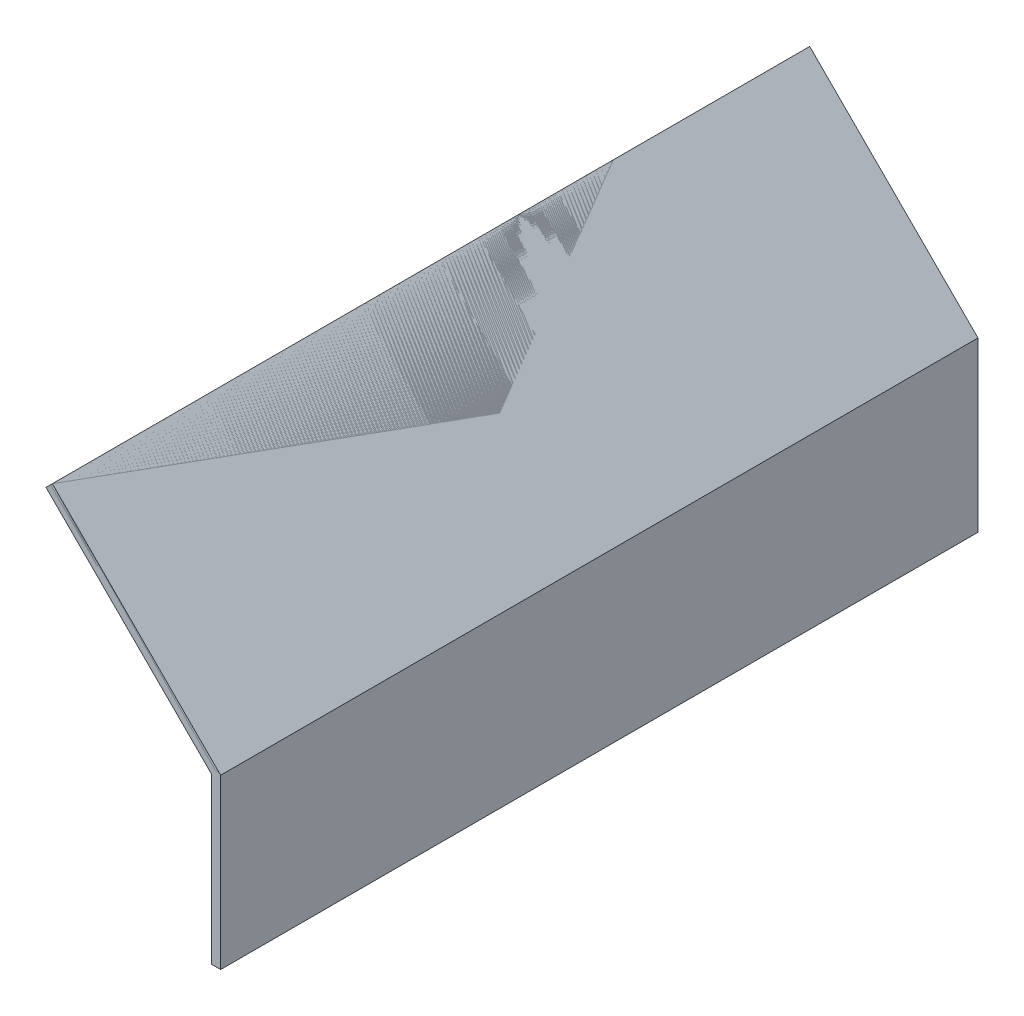
ISO-10303-21;
HEADER;
FILE_DESCRIPTION(('STEP AP214'),'2;1');
FILE_NAME('part.step','',(''),(''),'','','');
FILE_SCHEMA(('AUTOMOTIVE_DESIGN { 1 0 10303 214 1 1 1 1 }'));
ENDSEC;
DATA;
#1=APPLICATION_CONTEXT('core data for automotive mechanical design processes');
#2=APPLICATION_PROTOCOL_DEFINITION('international standard','automotive_design',2000,#1);
#3=PRODUCT_CONTEXT('',#1,'mechanical');
#4=PRODUCT('Part','Part','',(#3));
#5=PRODUCT_RELATED_PRODUCT_CATEGORY('part','',(#4));
#6=PRODUCT_DEFINITION_FORMATION('','',#4);
#7=PRODUCT_DEFINITION_CONTEXT('part definition',#1,'design');
#8=PRODUCT_DEFINITION('design','',#6,#7);
#9=PRODUCT_DEFINITION_SHAPE('','',#8);
#10=(LENGTH_UNIT() NAMED_UNIT(*) SI_UNIT(.MILLI.,.METRE.));
#11=(NAMED_UNIT(*) PLANE_ANGLE_UNIT() SI_UNIT($,.RADIAN.));
#12=(NAMED_UNIT(*) SI_UNIT($,.STERADIAN.) SOLID_ANGLE_UNIT());
#13=UNCERTAINTY_MEASURE_WITH_UNIT(LENGTH_MEASURE(1.E-05),#10,'distance_accuracy_value','');
#14=(GEOMETRIC_REPRESENTATION_CONTEXT(3) GLOBAL_UNCERTAINTY_ASSIGNED_CONTEXT((#13)) GLOBAL_UNIT_ASSIGNED_CONTEXT((#10,
#11,#12)) REPRESENTATION_CONTEXT('',''));
#15=CARTESIAN_POINT('',(0.,0.,0.));
#16=DIRECTION('',(0.,0.,1.));
#17=DIRECTION('',(1.,0.,0.));
#18=AXIS2_PLACEMENT_3D('',#15,#16,#17);
#19=CARTESIAN_POINT('',(4.064,76.2,0.));
#20=DIRECTION('',(0.,0.,-1.));
#21=DIRECTION('',(-0.707106781186549,0.707106781186546,0.));
#22=AXIS2_PLACEMENT_3D('',#19,#20,#21);
#23=PLANE('',#22);
#24=DIRECTION('',(-0.707106781186549,0.707106781186546,0.));
#25=VECTOR('',#24,1.);
#26=CARTESIAN_POINT('',(3.20548751482579,75.3414875148258,0.));
#27=LINE('',#26,#25);
#28=CARTESIAN_POINT('',(1.61939312693271,76.9275819027189,0.));
#29=VERTEX_POINT('',#28);
#30=CARTESIAN_POINT('',(-72.9945124851745,151.541487514826,0.));
#31=VERTEX_POINT('',#30);
#32=EDGE_CURVE('E182',#29,#31,#27,.T.);
#33=ORIENTED_EDGE('',*,*,#32,.F.);
#34=DIRECTION('',(1.,0.,0.));
#35=VECTOR('',#34,1.);
#36=CARTESIAN_POINT('',(-139.7,76.9275819027189,0.));
#37=LINE('',#36,#35);
#38=CARTESIAN_POINT('',(3.33641809728114,76.9275819027189,0.));
#39=VERTEX_POINT('',#38);
#40=EDGE_CURVE('E219',#29,#39,#37,.T.);
#41=ORIENTED_EDGE('',*,*,#40,.T.);
#42=DIRECTION('',(-0.707106781186549,0.707106781186546,0.));
#43=VECTOR('',#42,1.);
#44=CARTESIAN_POINT('',(4.064,76.2,0.));
#45=LINE('',#44,#43);
#46=CARTESIAN_POINT('',(-72.1360000000003,152.4,0.));
#47=VERTEX_POINT('',#46);
#48=EDGE_CURVE('E160',#39,#47,#45,.T.);
#49=ORIENTED_EDGE('',*,*,#48,.T.);
#50=DIRECTION('',(0.707106781186546,0.707106781186549,0.));
#51=VECTOR('',#50,1.);
#52=CARTESIAN_POINT('',(-72.1360000000003,152.4,0.));
#53=LINE('',#52,#51);
#54=EDGE_CURVE('E156',#31,#47,#53,.T.);
#55=ORIENTED_EDGE('',*,*,#54,.F.);
#56=EDGE_LOOP('',(#33,#41,#49,#55));
#57=FACE_BOUND('',#56,.T.);
#58=ADVANCED_FACE('F54',(#57),#23,.F.);
#59=CARTESIAN_POINT('',(3.20548751482579,75.3414875148258,-342.9));
#60=DIRECTION('',(0.707106781186546,0.707106781186549,0.));
#61=DIRECTION('',(-0.707106781186549,0.707106781186546,0.));
#62=AXIS2_PLACEMENT_3D('',#59,#60,#61);
#63=PLANE('',#62);
#64=DIRECTION('',(0.,0.,1.));
#65=VECTOR('',#64,1.);
#66=CARTESIAN_POINT('',(-72.9945124851745,151.541487514826,-342.9));
#67=LINE('',#66,#65);
#68=CARTESIAN_POINT('',(-72.9945124851745,151.541487514826,-254.));
#69=VERTEX_POINT('',#68);
#70=EDGE_CURVE('E181',#69,#31,#67,.T.);
#71=ORIENTED_EDGE('',*,*,#70,.F.);
#72=DIRECTION('',(0.707106781186549,-0.707106781186546,0.));
#73=VECTOR('',#72,1.);
#74=CARTESIAN_POINT('',(3.20548751482581,75.3414875148258,-254.));
#75=LINE('',#74,#73);
#76=CARTESIAN_POINT('',(1.61939312693271,76.9275819027189,-254.));
#77=VERTEX_POINT('',#76);
#78=EDGE_CURVE('E138',#69,#77,#75,.T.);
#79=ORIENTED_EDGE('',*,*,#78,.T.);
#80=DIRECTION('',(0.,0.,1.));
#81=VECTOR('',#80,1.);
#82=CARTESIAN_POINT('',(1.6193931269327,76.9275819027189,-342.9));
#83=LINE('',#82,#81);
#84=CARTESIAN_POINT('',(1.61939312693271,76.9275819027189,-206.375));
#85=VERTEX_POINT('',#84);
#86=EDGE_CURVE('E247',#77,#85,#83,.T.);
#87=ORIENTED_EDGE('',*,*,#86,.T.);
#88=DIRECTION('',(0.707106781186549,-0.707106781186546,0.));
#89=VECTOR('',#88,1.);
#90=CARTESIAN_POINT('',(3.20548751482579,75.3414875148258,-206.375));
#91=LINE('',#90,#89);
#92=CARTESIAN_POINT('',(2.47790561210692,76.0690694175447,-206.375));
#93=VERTEX_POINT('',#92);
#94=EDGE_CURVE('E270',#85,#93,#91,.T.);
#95=ORIENTED_EDGE('',*,*,#94,.T.);
#96=DIRECTION('',(0.,0.,1.));
#97=VECTOR('',#96,1.);
#98=CARTESIAN_POINT('',(2.47790561210692,76.0690694175447,-342.9));
#99=LINE('',#98,#97);
#100=CARTESIAN_POINT('',(2.47790561210692,76.0690694175447,-73.025));
#101=VERTEX_POINT('',#100);
#102=EDGE_CURVE('E174',#101,#93,#99,.F.);
#103=ORIENTED_EDGE('',*,*,#102,.F.);
#104=DIRECTION('',(-0.707106781186549,0.707106781186546,0.));
#105=VECTOR('',#104,1.);
#106=CARTESIAN_POINT('',(3.20548751482579,75.3414875148258,-73.025));
#107=LINE('',#106,#105);
#108=CARTESIAN_POINT('',(1.61939312693271,76.9275819027189,-73.025));
#109=VERTEX_POINT('',#108);
#110=EDGE_CURVE('E218',#101,#109,#107,.T.);
#111=ORIENTED_EDGE('',*,*,#110,.T.);
#112=DIRECTION('',(0.,0.,-1.));
#113=VECTOR('',#112,1.);
#114=CARTESIAN_POINT('',(1.6193931269327,76.9275819027189,-342.9));
#115=LINE('',#114,#113);
#116=EDGE_CURVE('E198',#29,#109,#115,.T.);
#117=ORIENTED_EDGE('',*,*,#116,.F.);
#118=ORIENTED_EDGE('',*,*,#32,.T.);
#119=EDGE_LOOP('',(#71,#79,#87,#95,#103,#111,#117,#118));
#120=FACE_BOUND('',#119,.T.);
#121=ADVANCED_FACE('F300',(#120),#63,.F.);
#122=CARTESIAN_POINT('',(4.06400000000001,0.,-342.9));
#123=DIRECTION('',(0.,1.,0.));
#124=DIRECTION('',(0.,0.,1.));
#125=AXIS2_PLACEMENT_3D('',#122,#123,#124);
#126=PLANE('',#125);
#127=DIRECTION('',(1.,0.,0.));
#128=VECTOR('',#127,1.);
#129=CARTESIAN_POINT('',(-139.7,0.,-206.375));
#130=LINE('',#129,#128);
#131=CARTESIAN_POINT('',(2.84988,0.,-206.375));
#132=VERTEX_POINT('',#131);
#133=CARTESIAN_POINT('',(4.06400000000001,0.,-206.375));
#134=VERTEX_POINT('',#133);
#135=EDGE_CURVE('E240',#132,#134,#130,.T.);
#136=ORIENTED_EDGE('',*,*,#135,.T.);
#137=DIRECTION('',(0.,0.,1.));
#138=VECTOR('',#137,1.);
#139=CARTESIAN_POINT('',(4.06400000000001,0.,-342.9));
#140=LINE('',#139,#138);
#141=CARTESIAN_POINT('',(4.06400000000001,0.,-73.025));
#142=VERTEX_POINT('',#141);
#143=EDGE_CURVE('E165',#134,#142,#140,.T.);
#144=ORIENTED_EDGE('',*,*,#143,.T.);
#145=DIRECTION('',(1.,0.,0.));
#146=VECTOR('',#145,1.);
#147=CARTESIAN_POINT('',(-139.7,0.,-73.025));
#148=LINE('',#147,#146);
#149=CARTESIAN_POINT('',(2.84988,0.,-73.025));
#150=VERTEX_POINT('',#149);
#151=EDGE_CURVE('E239',#150,#142,#148,.T.);
#152=ORIENTED_EDGE('',*,*,#151,.F.);
#153=DIRECTION('',(0.,0.,1.));
#154=VECTOR('',#153,1.);
#155=CARTESIAN_POINT('',(2.84988000000001,0.,-342.9));
#156=LINE('',#155,#154);
#157=EDGE_CURVE('E186',#132,#150,#156,.T.);
#158=ORIENTED_EDGE('',*,*,#157,.F.);
#159=EDGE_LOOP('',(#136,#144,#152,#158));
#160=FACE_BOUND('',#159,.T.);
#161=ADVANCED_FACE('F56',(#160),#126,.F.);
#162=CARTESIAN_POINT('',(-72.1360000000003,152.4,-342.9));
#163=DIRECTION('',(-0.707106781186549,0.707106781186546,0.));
#164=DIRECTION('',(0.,0.,1.));
#165=AXIS2_PLACEMENT_3D('',#162,#163,#164);
#166=PLANE('',#165);
#167=DIRECTION('',(0.707106781186546,0.707106781186549,0.));
#168=VECTOR('',#167,1.);
#169=CARTESIAN_POINT('',(-72.1360000000003,152.4,-254.));
#170=LINE('',#169,#168);
#171=CARTESIAN_POINT('',(-72.1360000000003,152.4,-254.));
#172=VERTEX_POINT('',#171);
#173=EDGE_CURVE('E135',#69,#172,#170,.T.);
#174=ORIENTED_EDGE('',*,*,#173,.F.);
#175=ORIENTED_EDGE('',*,*,#70,.T.);
#176=ORIENTED_EDGE('',*,*,#54,.T.);
#177=DIRECTION('',(0.,0.,1.));
#178=VECTOR('',#177,1.);
#179=CARTESIAN_POINT('',(-72.1360000000003,152.4,-342.9));
#180=LINE('',#179,#178);
#181=EDGE_CURVE('E148',#172,#47,#180,.T.);
#182=ORIENTED_EDGE('',*,*,#181,.F.);
#183=EDGE_LOOP('',(#174,#175,#176,#182));
#184=FACE_BOUND('',#183,.T.);
#185=ADVANCED_FACE('F154',(#184),#166,.T.);
#186=CARTESIAN_POINT('',(4.064,76.2,-342.9));
#187=DIRECTION('',(0.707106781186546,0.707106781186549,0.));
#188=DIRECTION('',(-0.707106781186549,0.707106781186546,0.));
#189=AXIS2_PLACEMENT_3D('',#186,#187,#188);
#190=PLANE('',#189);
#191=DIRECTION('',(0.707106781186549,-0.707106781186546,0.));
#192=VECTOR('',#191,1.);
#193=CARTESIAN_POINT('',(4.06400000000002,76.2,-254.));
#194=LINE('',#193,#192);
#195=CARTESIAN_POINT('',(3.33641809728113,76.9275819027189,-254.));
#196=VERTEX_POINT('',#195);
#197=EDGE_CURVE('E70',#172,#196,#194,.T.);
#198=ORIENTED_EDGE('',*,*,#197,.F.);
#199=ORIENTED_EDGE('',*,*,#181,.T.);
#200=ORIENTED_EDGE('',*,*,#48,.F.);
#201=DIRECTION('',(0.,0.,1.));
#202=VECTOR('',#201,1.);
#203=CARTESIAN_POINT('',(3.33641809728113,76.9275819027189,-342.9));
#204=LINE('',#203,#202);
#205=CARTESIAN_POINT('',(3.33641809728113,76.9275819027189,-73.025));
#206=VERTEX_POINT('',#205);
#207=EDGE_CURVE('E169',#39,#206,#204,.F.);
#208=ORIENTED_EDGE('',*,*,#207,.T.);
#209=CARTESIAN_POINT('',(3.33641809728114,76.9275819027189,-206.375));
#210=VERTEX_POINT('',#209);
#211=EDGE_CURVE('E173',#206,#210,#204,.F.);
#212=ORIENTED_EDGE('',*,*,#211,.T.);
#213=EDGE_CURVE('E151',#210,#196,#204,.F.);
#214=ORIENTED_EDGE('',*,*,#213,.T.);
#215=EDGE_LOOP('',(#198,#199,#200,#208,#212,#214));
#216=FACE_BOUND('',#215,.T.);
#217=ADVANCED_FACE('F146',(#216),#190,.T.);
#218=CARTESIAN_POINT('',(4.06400000000001,0.,-342.9));
#219=DIRECTION('',(1.,0.,0.));
#220=DIRECTION('',(0.,1.,0.));
#221=AXIS2_PLACEMENT_3D('',#218,#219,#220);
#222=PLANE('',#221);
#223=CARTESIAN_POINT('',(4.06400000000001,12.7,-193.675));
#224=DIRECTION('',(1.,0.,0.));
#225=DIRECTION('',(0.,1.,0.));
#226=AXIS2_PLACEMENT_3D('',#223,#224,#225);
#227=CIRCLE('',#226,3.26389999999998);
#228=CARTESIAN_POINT('',(4.06400000000001,15.9639,-193.675));
#229=VERTEX_POINT('',#228);
#230=EDGE_CURVE('E279',#229,#229,#227,.T.);
#231=ORIENTED_EDGE('',*,*,#230,.F.);
#232=EDGE_LOOP('',(#231));
#233=FACE_BOUND('',#232,.T.);
#234=CARTESIAN_POINT('',(4.06400000000001,12.7,-85.725));
#235=DIRECTION('',(1.,0.,0.));
#236=DIRECTION('',(0.,1.,0.));
#237=AXIS2_PLACEMENT_3D('',#234,#235,#236);
#238=CIRCLE('',#237,3.26389999999999);
#239=CARTESIAN_POINT('',(4.06400000000001,15.9639,-85.725));
#240=VERTEX_POINT('',#239);
#241=EDGE_CURVE('E285',#240,#240,#238,.T.);
#242=ORIENTED_EDGE('',*,*,#241,.F.);
#243=EDGE_LOOP('',(#242));
#244=FACE_BOUND('',#243,.T.);
#245=DIRECTION('',(0.,-1.,0.));
#246=VECTOR('',#245,1.);
#247=CARTESIAN_POINT('',(4.06400000000001,0.,-206.375));
#248=LINE('',#247,#246);
#249=CARTESIAN_POINT('',(4.064,75.1710438054377,-206.375));
#250=VERTEX_POINT('',#249);
#251=EDGE_CURVE('E251',#250,#134,#248,.T.);
#252=ORIENTED_EDGE('',*,*,#251,.F.);
#253=DIRECTION('',(0.,0.,1.));
#254=VECTOR('',#253,1.);
#255=CARTESIAN_POINT('',(4.064,75.1710438054377,-342.9));
#256=LINE('',#255,#254);
#257=CARTESIAN_POINT('',(4.064,75.1710438054377,-73.025));
#258=VERTEX_POINT('',#257);
#259=EDGE_CURVE('E159',#250,#258,#256,.T.);
#260=ORIENTED_EDGE('',*,*,#259,.T.);
#261=DIRECTION('',(0.,1.,0.));
#262=VECTOR('',#261,1.);
#263=CARTESIAN_POINT('',(4.06400000000001,0.,-73.025));
#264=LINE('',#263,#262);
#265=EDGE_CURVE('E191',#142,#258,#264,.T.);
#266=ORIENTED_EDGE('',*,*,#265,.F.);
#267=ORIENTED_EDGE('',*,*,#143,.F.);
#268=EDGE_LOOP('',(#252,#260,#266,#267));
#269=FACE_BOUND('',#268,.T.);
#270=ADVANCED_FACE('F249',(#233,#244,#269),#222,.T.);
#271=CARTESIAN_POINT('',(1.57988,75.1710438054377,-342.9));
#272=DIRECTION('',(0.,0.,1.));
#273=DIRECTION('',(1.,0.,0.));
#274=AXIS2_PLACEMENT_3D('',#271,#272,#273);
#275=CYLINDRICAL_SURFACE('',#274,2.48412);
#276=CARTESIAN_POINT('',(1.57988,75.1710438054377,-206.375));
#277=DIRECTION('',(0.,0.,1.));
#278=DIRECTION('',(1.,0.,0.));
#279=AXIS2_PLACEMENT_3D('',#276,#277,#278);
#280=CIRCLE('',#279,2.48412);
#281=EDGE_CURVE('E256',#210,#250,#280,.F.);
#282=ORIENTED_EDGE('',*,*,#281,.F.);
#283=ORIENTED_EDGE('',*,*,#211,.F.);
#284=CARTESIAN_POINT('',(1.57988,75.1710438054377,-73.025));
#285=DIRECTION('',(0.,0.,-1.));
#286=DIRECTION('',(-1.,0.,0.));
#287=AXIS2_PLACEMENT_3D('',#284,#285,#286);
#288=CIRCLE('',#287,2.48412);
#289=EDGE_CURVE('E224',#258,#206,#288,.F.);
#290=ORIENTED_EDGE('',*,*,#289,.F.);
#291=ORIENTED_EDGE('',*,*,#259,.F.);
#292=EDGE_LOOP('',(#282,#283,#290,#291));
#293=FACE_BOUND('',#292,.T.);
#294=ADVANCED_FACE('F254',(#293),#275,.T.);
#295=CARTESIAN_POINT('',(2.84988000000001,0.,-342.9));
#296=DIRECTION('',(1.,0.,0.));
#297=DIRECTION('',(0.,1.,0.));
#298=AXIS2_PLACEMENT_3D('',#295,#296,#297);
#299=PLANE('',#298);
#300=CARTESIAN_POINT('',(2.84988000000001,12.7,-193.675));
#301=DIRECTION('',(-1.,0.,0.));
#302=DIRECTION('',(0.,-1.,0.));
#303=AXIS2_PLACEMENT_3D('',#300,#301,#302);
#304=CIRCLE('',#303,3.26389999999998);
#305=CARTESIAN_POINT('',(2.84988000000001,9.43610000000001,-193.675));
#306=VERTEX_POINT('',#305);
#307=EDGE_CURVE('E289',#306,#306,#304,.T.);
#308=ORIENTED_EDGE('',*,*,#307,.F.);
#309=EDGE_LOOP('',(#308));
#310=FACE_BOUND('',#309,.T.);
#311=CARTESIAN_POINT('',(2.84988000000001,12.7,-85.725));
#312=DIRECTION('',(-1.,0.,0.));
#313=DIRECTION('',(0.,-1.,0.));
#314=AXIS2_PLACEMENT_3D('',#311,#312,#313);
#315=CIRCLE('',#314,3.26389999999999);
#316=CARTESIAN_POINT('',(2.84988000000001,9.4361,-85.725));
#317=VERTEX_POINT('',#316);
#318=EDGE_CURVE('E290',#317,#317,#315,.T.);
#319=ORIENTED_EDGE('',*,*,#318,.F.);
#320=EDGE_LOOP('',(#319));
#321=FACE_BOUND('',#320,.T.);
#322=DIRECTION('',(0.,0.,1.));
#323=VECTOR('',#322,1.);
#324=CARTESIAN_POINT('',(2.84988,75.1710438054377,-342.9));
#325=LINE('',#324,#323);
#326=CARTESIAN_POINT('',(2.84988,75.1710438054377,-206.375));
#327=VERTEX_POINT('',#326);
#328=CARTESIAN_POINT('',(2.84988,75.1710438054377,-73.025));
#329=VERTEX_POINT('',#328);
#330=EDGE_CURVE('E178',#327,#329,#325,.T.);
#331=ORIENTED_EDGE('',*,*,#330,.F.);
#332=DIRECTION('',(0.,-1.,0.));
#333=VECTOR('',#332,1.);
#334=CARTESIAN_POINT('',(2.84988000000001,0.,-206.375));
#335=LINE('',#334,#333);
#336=EDGE_CURVE('E77',#327,#132,#335,.T.);
#337=ORIENTED_EDGE('',*,*,#336,.T.);
#338=ORIENTED_EDGE('',*,*,#157,.T.);
#339=DIRECTION('',(0.,1.,0.));
#340=VECTOR('',#339,1.);
#341=CARTESIAN_POINT('',(2.84988000000001,0.,-73.025));
#342=LINE('',#341,#340);
#343=EDGE_CURVE('E213',#150,#329,#342,.T.);
#344=ORIENTED_EDGE('',*,*,#343,.T.);
#345=EDGE_LOOP('',(#331,#337,#338,#344));
#346=FACE_BOUND('',#345,.T.);
#347=ADVANCED_FACE('F210',(#310,#321,#346),#299,.F.);
#348=CARTESIAN_POINT('',(1.57988,75.1710438054377,-342.9));
#349=DIRECTION('',(0.,0.,1.));
#350=DIRECTION('',(1.,0.,0.));
#351=AXIS2_PLACEMENT_3D('',#348,#349,#350);
#352=CYLINDRICAL_SURFACE('',#351,1.27);
#353=ORIENTED_EDGE('',*,*,#102,.T.);
#354=CARTESIAN_POINT('',(1.57988,75.1710438054377,-206.375));
#355=DIRECTION('',(0.,0.,1.));
#356=DIRECTION('',(1.,0.,0.));
#357=AXIS2_PLACEMENT_3D('',#354,#355,#356);
#358=CIRCLE('',#357,1.27);
#359=EDGE_CURVE('E63',#93,#327,#358,.F.);
#360=ORIENTED_EDGE('',*,*,#359,.T.);
#361=ORIENTED_EDGE('',*,*,#330,.T.);
#362=CARTESIAN_POINT('',(1.57988,75.1710438054377,-73.025));
#363=DIRECTION('',(0.,0.,-1.));
#364=DIRECTION('',(-1.,0.,0.));
#365=AXIS2_PLACEMENT_3D('',#362,#363,#364);
#366=CIRCLE('',#365,1.27);
#367=EDGE_CURVE('E194',#329,#101,#366,.F.);
#368=ORIENTED_EDGE('',*,*,#367,.T.);
#369=EDGE_LOOP('',(#353,#360,#361,#368));
#370=FACE_BOUND('',#369,.T.);
#371=ADVANCED_FACE('F203',(#370),#352,.F.);
#372=CARTESIAN_POINT('',(-139.7,76.9275819027189,0.));
#373=DIRECTION('',(0.,-1.,0.));
#374=DIRECTION('',(0.,0.,-1.));
#375=AXIS2_PLACEMENT_3D('',#372,#373,#374);
#376=PLANE('',#375);
#377=ORIENTED_EDGE('',*,*,#40,.F.);
#378=ORIENTED_EDGE('',*,*,#116,.T.);
#379=DIRECTION('',(1.,0.,0.));
#380=VECTOR('',#379,1.);
#381=CARTESIAN_POINT('',(-139.7,76.9275819027189,-73.025));
#382=LINE('',#381,#380);
#383=EDGE_CURVE('E227',#109,#206,#382,.T.);
#384=ORIENTED_EDGE('',*,*,#383,.T.);
#385=ORIENTED_EDGE('',*,*,#207,.F.);
#386=EDGE_LOOP('',(#377,#378,#384,#385));
#387=FACE_BOUND('',#386,.T.);
#388=ADVANCED_FACE('F260',(#387),#376,.T.);
#389=CARTESIAN_POINT('',(-139.7,0.,-73.025));
#390=DIRECTION('',(0.,0.,-1.));
#391=DIRECTION('',(-1.,0.,0.));
#392=AXIS2_PLACEMENT_3D('',#389,#390,#391);
#393=PLANE('',#392);
#394=ORIENTED_EDGE('',*,*,#265,.T.);
#395=ORIENTED_EDGE('',*,*,#289,.T.);
#396=ORIENTED_EDGE('',*,*,#383,.F.);
#397=ORIENTED_EDGE('',*,*,#110,.F.);
#398=ORIENTED_EDGE('',*,*,#367,.F.);
#399=ORIENTED_EDGE('',*,*,#343,.F.);
#400=ORIENTED_EDGE('',*,*,#151,.T.);
#401=EDGE_LOOP('',(#394,#395,#396,#397,#398,#399,#400));
#402=FACE_BOUND('',#401,.T.);
#403=ADVANCED_FACE('F244',(#402),#393,.F.);
#404=CARTESIAN_POINT('',(-139.7,76.9275819027189,-292.1));
#405=DIRECTION('',(0.,1.,0.));
#406=DIRECTION('',(0.,0.,1.));
#407=AXIS2_PLACEMENT_3D('',#404,#405,#406);
#408=PLANE('',#407);
#409=ORIENTED_EDGE('',*,*,#86,.F.);
#410=DIRECTION('',(1.,0.,0.));
#411=VECTOR('',#410,1.);
#412=CARTESIAN_POINT('',(-139.7,76.9275819027189,-254.));
#413=LINE('',#412,#411);
#414=EDGE_CURVE('E12',#77,#196,#413,.T.);
#415=ORIENTED_EDGE('',*,*,#414,.T.);
#416=ORIENTED_EDGE('',*,*,#213,.F.);
#417=DIRECTION('',(1.,0.,0.));
#418=VECTOR('',#417,1.);
#419=CARTESIAN_POINT('',(-139.7,76.9275819027189,-206.375));
#420=LINE('',#419,#418);
#421=EDGE_CURVE('E275',#85,#210,#420,.T.);
#422=ORIENTED_EDGE('',*,*,#421,.F.);
#423=EDGE_LOOP('',(#409,#415,#416,#422));
#424=FACE_BOUND('',#423,.T.);
#425=ADVANCED_FACE('F303',(#424),#408,.F.);
#426=CARTESIAN_POINT('',(-139.7,0.,-206.375));
#427=DIRECTION('',(0.,0.,1.));
#428=DIRECTION('',(1.,0.,0.));
#429=AXIS2_PLACEMENT_3D('',#426,#427,#428);
#430=PLANE('',#429);
#431=ORIENTED_EDGE('',*,*,#251,.T.);
#432=ORIENTED_EDGE('',*,*,#135,.F.);
#433=ORIENTED_EDGE('',*,*,#336,.F.);
#434=ORIENTED_EDGE('',*,*,#359,.F.);
#435=ORIENTED_EDGE('',*,*,#94,.F.);
#436=ORIENTED_EDGE('',*,*,#421,.T.);
#437=ORIENTED_EDGE('',*,*,#281,.T.);
#438=EDGE_LOOP('',(#431,#432,#433,#434,#435,#436,#437));
#439=FACE_BOUND('',#438,.T.);
#440=ADVANCED_FACE('F304',(#439),#430,.F.);
#441=CARTESIAN_POINT('',(294.94988,12.7,-85.725));
#442=DIRECTION('',(-1.,0.,0.));
#443=DIRECTION('',(0.,-1.,0.));
#444=AXIS2_PLACEMENT_3D('',#441,#442,#443);
#445=CYLINDRICAL_SURFACE('',#444,3.26389999999999);
#446=ORIENTED_EDGE('',*,*,#241,.T.);
#447=EDGE_LOOP('',(#446));
#448=FACE_BOUND('',#447,.T.);
#449=ORIENTED_EDGE('',*,*,#318,.T.);
#450=EDGE_LOOP('',(#449));
#451=FACE_BOUND('',#450,.T.);
#452=ADVANCED_FACE('F378',(#448,#451),#445,.F.);
#453=CARTESIAN_POINT('',(294.94988,12.7,-193.675));
#454=DIRECTION('',(-1.,0.,0.));
#455=DIRECTION('',(0.,-1.,0.));
#456=AXIS2_PLACEMENT_3D('',#453,#454,#455);
#457=CYLINDRICAL_SURFACE('',#456,3.26389999999998);
#458=ORIENTED_EDGE('',*,*,#230,.T.);
#459=EDGE_LOOP('',(#458));
#460=FACE_BOUND('',#459,.T.);
#461=ORIENTED_EDGE('',*,*,#307,.T.);
#462=EDGE_LOOP('',(#461));
#463=FACE_BOUND('',#462,.T.);
#464=ADVANCED_FACE('F338',(#460,#463),#457,.F.);
#465=CARTESIAN_POINT('',(-75.0096819587424,152.4,-254.));
#466=DIRECTION('',(0.,0.,1.));
#467=DIRECTION('',(0.,-1.,0.));
#468=AXIS2_PLACEMENT_3D('',#465,#466,#467);
#469=PLANE('',#468);
#470=ORIENTED_EDGE('',*,*,#173,.T.);
#471=ORIENTED_EDGE('',*,*,#197,.T.);
#472=ORIENTED_EDGE('',*,*,#414,.F.);
#473=ORIENTED_EDGE('',*,*,#78,.F.);
#474=EDGE_LOOP('',(#470,#471,#472,#473));
#475=FACE_BOUND('',#474,.T.);
#476=ADVANCED_FACE('F136',(#475),#469,.F.);
#477=CLOSED_SHELL('',(#58,#121,#161,#185,#217,#270,#294,#347,#371,#388,#403,#425,#440,#452,#464,#476));
#478=MANIFOLD_SOLID_BREP('B2',#477);
#479=CARTESIAN_POINT('',(0.,74.5166360825157,-342.9));
#480=DIRECTION('',(-1.,0.,0.));
#481=DIRECTION('',(0.,0.,1.));
#482=AXIS2_PLACEMENT_3D('',#479,#480,#481);
#483=PLANE('',#482);
#484=DIRECTION('',(0.,-1.,0.));
#485=VECTOR('',#484,1.);
#486=CARTESIAN_POINT('',(0.,74.5166360825157,0.));
#487=LINE('',#486,#485);
#488=CARTESIAN_POINT('',(0.,74.5166360825157,0.));
#489=VERTEX_POINT('',#488);
#490=CARTESIAN_POINT('',(0.,0.,0.));
#491=VERTEX_POINT('',#490);
#492=EDGE_CURVE('E570',#489,#491,#487,.T.);
#493=ORIENTED_EDGE('',*,*,#492,.F.);
#494=DIRECTION('',(0.,0.,1.));
#495=VECTOR('',#494,1.);
#496=CARTESIAN_POINT('',(0.,74.5166360825157,-342.9));
#497=LINE('',#496,#495);
#498=CARTESIAN_POINT('',(0.,74.5166360825157,-342.9));
#499=VERTEX_POINT('',#498);
#500=EDGE_CURVE('E52',#499,#489,#497,.T.);
#501=ORIENTED_EDGE('',*,*,#500,.F.);
#502=DIRECTION('',(0.,-1.,0.));
#503=VECTOR('',#502,1.);
#504=CARTESIAN_POINT('',(0.,74.5166360825157,-342.9));
#505=LINE('',#504,#503);
#506=CARTESIAN_POINT('',(0.,0.,-342.9));
#507=VERTEX_POINT('',#506);
#508=EDGE_CURVE('E583',#499,#507,#505,.T.);
#509=ORIENTED_EDGE('',*,*,#508,.T.);
#510=DIRECTION('',(0.,0.,1.));
#511=VECTOR('',#510,1.);
#512=CARTESIAN_POINT('',(0.,0.,-342.9));
#513=LINE('',#512,#511);
#514=EDGE_CURVE('E484',#507,#491,#513,.T.);
#515=ORIENTED_EDGE('',*,*,#514,.T.);
#516=EDGE_LOOP('',(#493,#501,#509,#515));
#517=FACE_BOUND('',#516,.T.);
#518=ADVANCED_FACE('F481',(#517),#483,.T.);
#519=CARTESIAN_POINT('',(0.,74.5166360825157,-342.9));
#520=DIRECTION('',(-0.707106781186547,-0.707106781186548,0.));
#521=DIRECTION('',(0.707106781186548,-0.707106781186547,0.));
#522=AXIS2_PLACEMENT_3D('',#519,#520,#521);
#523=PLANE('',#522);
#524=DIRECTION('',(0.707106781186547,-0.707106781186547,0.));
#525=VECTOR('',#524,1.);
#526=CARTESIAN_POINT('',(0.,74.5166360825157,0.));
#527=LINE('',#526,#525);
#528=CARTESIAN_POINT('',(-75.0096819587424,149.526318041258,0.));
#529=VERTEX_POINT('',#528);
#530=EDGE_CURVE('E518',#529,#489,#527,.T.);
#531=ORIENTED_EDGE('',*,*,#530,.F.);
#532=DIRECTION('',(0.,0.,1.));
#533=VECTOR('',#532,1.);
#534=CARTESIAN_POINT('',(-75.0096819587424,149.526318041258,-342.9));
#535=LINE('',#534,#533);
#536=CARTESIAN_POINT('',(-75.0096819587424,149.526318041258,-342.9));
#537=VERTEX_POINT('',#536);
#538=EDGE_CURVE('E490',#537,#529,#535,.T.);
#539=ORIENTED_EDGE('',*,*,#538,.F.);
#540=DIRECTION('',(0.707106781186838,-0.707106781186257,0.));
#541=VECTOR('',#540,1.);
#542=CARTESIAN_POINT('',(-75.0096819587424,149.526318041258,-342.9));
#543=LINE('',#542,#541);
#544=EDGE_CURVE('E498',#537,#499,#543,.T.);
#545=ORIENTED_EDGE('',*,*,#544,.T.);
#546=ORIENTED_EDGE('',*,*,#500,.T.);
#547=EDGE_LOOP('',(#531,#539,#545,#546));
#548=FACE_BOUND('',#547,.T.);
#549=ADVANCED_FACE('F605',(#548),#523,.T.);
#550=CARTESIAN_POINT('',(-72.1360000000003,152.4,-342.9));
#551=DIRECTION('',(-0.707106781186551,0.707106781186544,0.));
#552=DIRECTION('',(-0.707106781186544,-0.707106781186551,0.));
#553=AXIS2_PLACEMENT_3D('',#550,#551,#552);
#554=PLANE('',#553);
#555=DIRECTION('',(-0.707106781186544,-0.707106781186551,0.));
#556=VECTOR('',#555,1.);
#557=CARTESIAN_POINT('',(-72.1360000000003,152.4,0.));
#558=LINE('',#557,#556);
#559=CARTESIAN_POINT('',(-72.1360000000003,152.4,0.));
#560=VERTEX_POINT('',#559);
#561=EDGE_CURVE('E543',#560,#529,#558,.T.);
#562=ORIENTED_EDGE('',*,*,#561,.F.);
#563=DIRECTION('',(0.,0.,1.));
#564=VECTOR('',#563,1.);
#565=CARTESIAN_POINT('',(-72.1360000000003,152.4,-342.9));
#566=LINE('',#565,#564);
#567=CARTESIAN_POINT('',(-72.1360000000003,152.4,-342.9));
#568=VERTEX_POINT('',#567);
#569=EDGE_CURVE('E538',#568,#560,#566,.T.);
#570=ORIENTED_EDGE('',*,*,#569,.F.);
#571=DIRECTION('',(-0.707106781186544,-0.707106781186551,0.));
#572=VECTOR('',#571,1.);
#573=CARTESIAN_POINT('',(-72.1360000000003,152.4,-342.9));
#574=LINE('',#573,#572);
#575=EDGE_CURVE('E541',#568,#537,#574,.T.);
#576=ORIENTED_EDGE('',*,*,#575,.T.);
#577=ORIENTED_EDGE('',*,*,#538,.T.);
#578=EDGE_LOOP('',(#562,#570,#576,#577));
#579=FACE_BOUND('',#578,.T.);
#580=ADVANCED_FACE('F540',(#579),#554,.T.);
#581=CARTESIAN_POINT('',(4.064,76.2,-342.9));
#582=DIRECTION('',(0.707106781186546,0.707106781186549,0.));
#583=DIRECTION('',(-0.707106781186549,0.707106781186546,0.));
#584=AXIS2_PLACEMENT_3D('',#581,#582,#583);
#585=PLANE('',#584);
#586=DIRECTION('',(-0.707106781186549,0.707106781186546,0.));
#587=VECTOR('',#586,1.);
#588=CARTESIAN_POINT('',(4.064,76.2,0.));
#589=LINE('',#588,#587);
#590=CARTESIAN_POINT('',(4.064,76.2,0.));
#591=VERTEX_POINT('',#590);
#592=EDGE_CURVE('E580',#591,#560,#589,.T.);
#593=ORIENTED_EDGE('',*,*,#592,.F.);
#594=DIRECTION('',(0.,0.,1.));
#595=VECTOR('',#594,1.);
#596=CARTESIAN_POINT('',(4.064,76.2,-342.9));
#597=LINE('',#596,#595);
#598=CARTESIAN_POINT('',(4.064,76.2,-342.9));
#599=VERTEX_POINT('',#598);
#600=EDGE_CURVE('E549',#599,#591,#597,.T.);
#601=ORIENTED_EDGE('',*,*,#600,.F.);
#602=DIRECTION('',(-0.707106781186549,0.707106781186546,0.));
#603=VECTOR('',#602,1.);
#604=CARTESIAN_POINT('',(4.064,76.2,-342.9));
#605=LINE('',#604,#603);
#606=EDGE_CURVE('E556',#599,#568,#605,.T.);
#607=ORIENTED_EDGE('',*,*,#606,.T.);
#608=ORIENTED_EDGE('',*,*,#569,.T.);
#609=EDGE_LOOP('',(#593,#601,#607,#608));
#610=FACE_BOUND('',#609,.T.);
#611=ADVANCED_FACE('F559',(#610),#585,.T.);
#612=CARTESIAN_POINT('',(4.06400000000001,0.,-342.9));
#613=DIRECTION('',(1.,0.,0.));
#614=DIRECTION('',(0.,1.,0.));
#615=AXIS2_PLACEMENT_3D('',#612,#613,#614);
#616=PLANE('',#615);
#617=DIRECTION('',(0.,1.,0.));
#618=VECTOR('',#617,1.);
#619=CARTESIAN_POINT('',(4.06400000000001,0.,0.));
#620=LINE('',#619,#618);
#621=CARTESIAN_POINT('',(4.06400000000001,0.,0.));
#622=VERTEX_POINT('',#621);
#623=EDGE_CURVE('E576',#622,#591,#620,.T.);
#624=ORIENTED_EDGE('',*,*,#623,.F.);
#625=DIRECTION('',(0.,0.,1.));
#626=VECTOR('',#625,1.);
#627=CARTESIAN_POINT('',(4.06400000000001,0.,-342.9));
#628=LINE('',#627,#626);
#629=CARTESIAN_POINT('',(4.06400000000001,0.,-342.9));
#630=VERTEX_POINT('',#629);
#631=EDGE_CURVE('E586',#630,#622,#628,.T.);
#632=ORIENTED_EDGE('',*,*,#631,.F.);
#633=DIRECTION('',(0.,1.,0.));
#634=VECTOR('',#633,1.);
#635=CARTESIAN_POINT('',(4.06400000000001,0.,-342.9));
#636=LINE('',#635,#634);
#637=EDGE_CURVE('E561',#630,#599,#636,.T.);
#638=ORIENTED_EDGE('',*,*,#637,.T.);
#639=ORIENTED_EDGE('',*,*,#600,.T.);
#640=EDGE_LOOP('',(#624,#632,#638,#639));
#641=FACE_BOUND('',#640,.T.);
#642=ADVANCED_FACE('F595',(#641),#616,.T.);
#643=CARTESIAN_POINT('',(0.,0.,-342.9));
#644=DIRECTION('',(0.,-1.,0.));
#645=DIRECTION('',(0.,0.,-1.));
#646=AXIS2_PLACEMENT_3D('',#643,#644,#645);
#647=PLANE('',#646);
#648=DIRECTION('',(1.,0.,0.));
#649=VECTOR('',#648,1.);
#650=CARTESIAN_POINT('',(0.,0.,0.));
#651=LINE('',#650,#649);
#652=EDGE_CURVE('E573',#491,#622,#651,.T.);
#653=ORIENTED_EDGE('',*,*,#652,.F.);
#654=ORIENTED_EDGE('',*,*,#514,.F.);
#655=DIRECTION('',(1.,0.,0.));
#656=VECTOR('',#655,1.);
#657=CARTESIAN_POINT('',(0.,0.,-342.9));
#658=LINE('',#657,#656);
#659=EDGE_CURVE('E565',#507,#630,#658,.T.);
#660=ORIENTED_EDGE('',*,*,#659,.T.);
#661=ORIENTED_EDGE('',*,*,#631,.T.);
#662=EDGE_LOOP('',(#653,#654,#660,#661));
#663=FACE_BOUND('',#662,.T.);
#664=ADVANCED_FACE('F591',(#663),#647,.T.);
#665=CARTESIAN_POINT('',(0.,0.,-342.9));
#666=DIRECTION('',(0.,0.,1.));
#667=DIRECTION('',(1.,0.,0.));
#668=AXIS2_PLACEMENT_3D('',#665,#666,#667);
#669=PLANE('',#668);
#670=ORIENTED_EDGE('',*,*,#508,.F.);
#671=ORIENTED_EDGE('',*,*,#544,.F.);
#672=ORIENTED_EDGE('',*,*,#575,.F.);
#673=ORIENTED_EDGE('',*,*,#606,.F.);
#674=ORIENTED_EDGE('',*,*,#637,.F.);
#675=ORIENTED_EDGE('',*,*,#659,.F.);
#676=EDGE_LOOP('',(#670,#671,#672,#673,#674,#675));
#677=FACE_BOUND('',#676,.T.);
#678=ADVANCED_FACE('F554',(#677),#669,.F.);
#679=CARTESIAN_POINT('',(0.,0.,0.));
#680=DIRECTION('',(0.,0.,1.));
#681=DIRECTION('',(1.,0.,0.));
#682=AXIS2_PLACEMENT_3D('',#679,#680,#681);
#683=PLANE('',#682);
#684=ORIENTED_EDGE('',*,*,#492,.T.);
#685=ORIENTED_EDGE('',*,*,#652,.T.);
#686=ORIENTED_EDGE('',*,*,#623,.T.);
#687=ORIENTED_EDGE('',*,*,#592,.T.);
#688=ORIENTED_EDGE('',*,*,#561,.T.);
#689=ORIENTED_EDGE('',*,*,#530,.T.);
#690=EDGE_LOOP('',(#684,#685,#686,#687,#688,#689));
#691=FACE_BOUND('',#690,.T.);
#692=ADVANCED_FACE('F593',(#691),#683,.T.);
#693=CLOSED_SHELL('',(#518,#549,#580,#611,#642,#664,#678,#692));
#694=MANIFOLD_SOLID_BREP('B6_NOT_SHOWN',#693);
#695=ADVANCED_BREP_SHAPE_REPRESENTATION('',(#18,#478,#694),#14);
#696=SHAPE_DEFINITION_REPRESENTATION(#9,#695);
ENDSEC;
END-ISO-10303-21;
